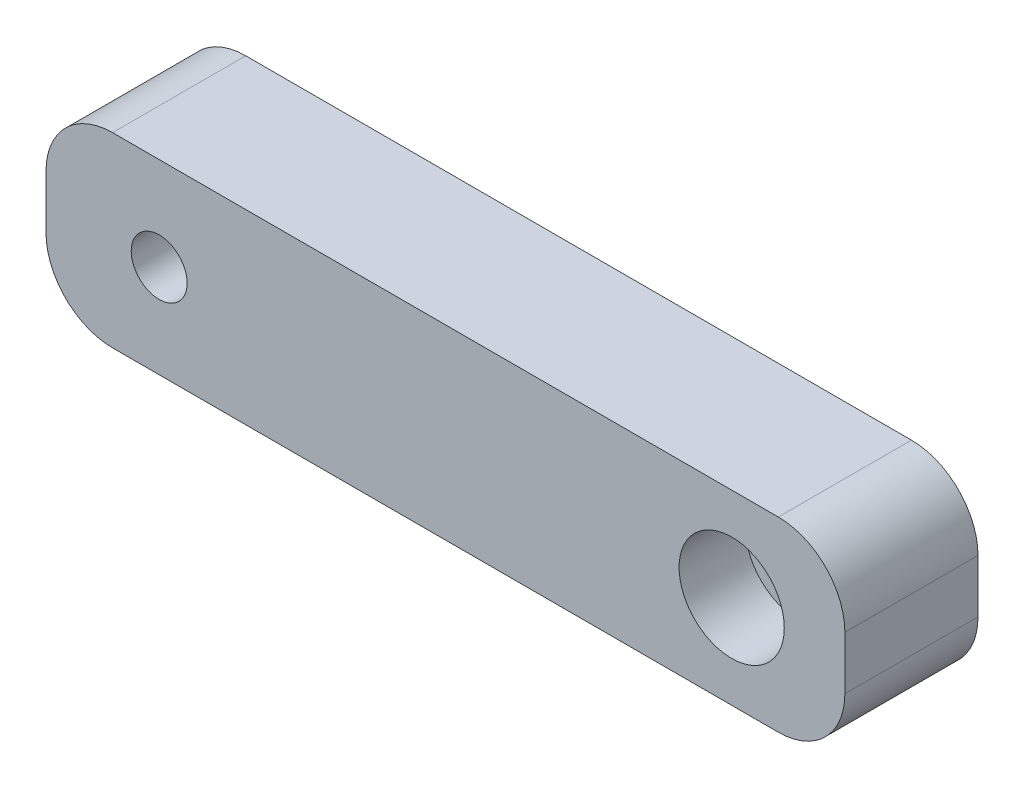
ISO-10303-21;
HEADER;
FILE_DESCRIPTION(('STEP AP214'),'2;1');
FILE_NAME('part.step','',(''),(''),'','','');
FILE_SCHEMA(('AUTOMOTIVE_DESIGN { 1 0 10303 214 1 1 1 1 }'));
ENDSEC;
DATA;
#1=APPLICATION_CONTEXT('core data for automotive mechanical design processes');
#2=APPLICATION_PROTOCOL_DEFINITION('international standard','automotive_design',2000,#1);
#3=PRODUCT_CONTEXT('',#1,'mechanical');
#4=PRODUCT('Part','Part','',(#3));
#5=PRODUCT_RELATED_PRODUCT_CATEGORY('part','',(#4));
#6=PRODUCT_DEFINITION_FORMATION('','',#4);
#7=PRODUCT_DEFINITION_CONTEXT('part definition',#1,'design');
#8=PRODUCT_DEFINITION('design','',#6,#7);
#9=PRODUCT_DEFINITION_SHAPE('','',#8);
#10=(LENGTH_UNIT() NAMED_UNIT(*) SI_UNIT(.MILLI.,.METRE.));
#11=(NAMED_UNIT(*) PLANE_ANGLE_UNIT() SI_UNIT($,.RADIAN.));
#12=(NAMED_UNIT(*) SI_UNIT($,.STERADIAN.) SOLID_ANGLE_UNIT());
#13=UNCERTAINTY_MEASURE_WITH_UNIT(LENGTH_MEASURE(1.E-05),#10,'distance_accuracy_value','');
#14=(GEOMETRIC_REPRESENTATION_CONTEXT(3) GLOBAL_UNCERTAINTY_ASSIGNED_CONTEXT((#13)) GLOBAL_UNIT_ASSIGNED_CONTEXT((#10,
#11,#12)) REPRESENTATION_CONTEXT('',''));
#15=CARTESIAN_POINT('',(0.,0.,0.));
#16=DIRECTION('',(0.,0.,1.));
#17=DIRECTION('',(1.,0.,0.));
#18=AXIS2_PLACEMENT_3D('',#15,#16,#17);
#19=CARTESIAN_POINT('',(-7.85061824324326,13.3019459459459,-0.00100000000000013));
#20=DIRECTION('',(0.,0.,1.));
#21=DIRECTION('',(1.,0.,0.));
#22=AXIS2_PLACEMENT_3D('',#19,#20,#21);
#23=CYLINDRICAL_SURFACE('',#22,2.);
#24=CARTESIAN_POINT('',(-7.85061824324326,13.3019459459459,5.));
#25=DIRECTION('',(0.,0.,1.));
#26=DIRECTION('',(1.,0.,0.));
#27=AXIS2_PLACEMENT_3D('',#24,#25,#26);
#28=CIRCLE('',#27,2.);
#29=CARTESIAN_POINT('',(-5.85061824324326,13.3019459459459,5.));
#30=VERTEX_POINT('',#29);
#31=EDGE_CURVE('E389',#30,#30,#28,.T.);
#32=ORIENTED_EDGE('',*,*,#31,.T.);
#33=EDGE_LOOP('',(#32));
#34=FACE_BOUND('',#33,.T.);
#35=CARTESIAN_POINT('',(-7.85061824324326,13.3019459459459,0.5));
#36=DIRECTION('',(0.,0.,-1.));
#37=DIRECTION('',(-1.,0.,0.));
#38=AXIS2_PLACEMENT_3D('',#35,#36,#37);
#39=CIRCLE('',#38,2.);
#40=CARTESIAN_POINT('',(-9.85061824324326,13.3019459459459,0.5));
#41=VERTEX_POINT('',#40);
#42=EDGE_CURVE('E53',#41,#41,#39,.F.);
#43=ORIENTED_EDGE('',*,*,#42,.F.);
#44=EDGE_LOOP('',(#43));
#45=FACE_BOUND('',#44,.T.);
#46=ADVANCED_FACE('F49',(#34,#45),#23,.F.);
#47=CARTESIAN_POINT('',(-59.3506182432433,20.3019459459459,10.));
#48=DIRECTION('',(1.,0.,0.));
#49=DIRECTION('',(0.,0.,-1.));
#50=AXIS2_PLACEMENT_3D('',#47,#48,#49);
#51=PLANE('',#50);
#52=DIRECTION('',(0.,-1.,0.));
#53=VECTOR('',#52,1.);
#54=CARTESIAN_POINT('',(-59.3506182432433,20.3019459459459,0.));
#55=LINE('',#54,#53);
#56=CARTESIAN_POINT('',(-59.3506182432433,15.3019459459459,0.));
#57=VERTEX_POINT('',#56);
#58=CARTESIAN_POINT('',(-59.3506182432433,11.3019459459459,0.));
#59=VERTEX_POINT('',#58);
#60=EDGE_CURVE('E131',#57,#59,#55,.T.);
#61=ORIENTED_EDGE('',*,*,#60,.T.);
#62=DIRECTION('',(0.,0.,-1.));
#63=VECTOR('',#62,1.);
#64=CARTESIAN_POINT('',(-59.3506182432433,11.3019459459459,10.));
#65=LINE('',#64,#63);
#66=CARTESIAN_POINT('',(-59.3506182432433,11.3019459459459,10.));
#67=VERTEX_POINT('',#66);
#68=EDGE_CURVE('E11',#59,#67,#65,.F.);
#69=ORIENTED_EDGE('',*,*,#68,.T.);
#70=DIRECTION('',(0.,-1.,0.));
#71=VECTOR('',#70,1.);
#72=CARTESIAN_POINT('',(-59.3506182432433,20.3019459459459,10.));
#73=LINE('',#72,#71);
#74=CARTESIAN_POINT('',(-59.3506182432433,15.3019459459459,10.));
#75=VERTEX_POINT('',#74);
#76=EDGE_CURVE('E132',#75,#67,#73,.T.);
#77=ORIENTED_EDGE('',*,*,#76,.F.);
#78=DIRECTION('',(0.,0.,-1.));
#79=VECTOR('',#78,1.);
#80=CARTESIAN_POINT('',(-59.3506182432433,15.3019459459459,0.));
#81=LINE('',#80,#79);
#82=EDGE_CURVE('E122',#75,#57,#81,.T.);
#83=ORIENTED_EDGE('',*,*,#82,.T.);
#84=EDGE_LOOP('',(#61,#69,#77,#83));
#85=FACE_BOUND('',#84,.T.);
#86=ADVANCED_FACE('F130',(#85),#51,.F.);
#87=CARTESIAN_POINT('',(-59.3506182432433,6.30194594594594,10.));
#88=DIRECTION('',(0.,1.,0.));
#89=DIRECTION('',(0.,0.,1.));
#90=AXIS2_PLACEMENT_3D('',#87,#88,#89);
#91=PLANE('',#90);
#92=DIRECTION('',(1.,0.,0.));
#93=VECTOR('',#92,1.);
#94=CARTESIAN_POINT('',(-59.3506182432433,6.30194594594594,0.));
#95=LINE('',#94,#93);
#96=CARTESIAN_POINT('',(-54.3506182432433,6.30194594594594,0.));
#97=VERTEX_POINT('',#96);
#98=CARTESIAN_POINT('',(-4.35061824324326,6.30194594594594,0.));
#99=VERTEX_POINT('',#98);
#100=EDGE_CURVE('E141',#97,#99,#95,.T.);
#101=ORIENTED_EDGE('',*,*,#100,.T.);
#102=DIRECTION('',(0.,0.,-1.));
#103=VECTOR('',#102,1.);
#104=CARTESIAN_POINT('',(-4.35061824324326,6.30194594594594,10.));
#105=LINE('',#104,#103);
#106=CARTESIAN_POINT('',(-4.35061824324326,6.30194594594594,10.));
#107=VERTEX_POINT('',#106);
#108=EDGE_CURVE('E184',#99,#107,#105,.F.);
#109=ORIENTED_EDGE('',*,*,#108,.T.);
#110=DIRECTION('',(1.,0.,0.));
#111=VECTOR('',#110,1.);
#112=CARTESIAN_POINT('',(-59.3506182432433,6.30194594594594,10.));
#113=LINE('',#112,#111);
#114=CARTESIAN_POINT('',(-54.3506182432433,6.30194594594594,10.));
#115=VERTEX_POINT('',#114);
#116=EDGE_CURVE('E409',#115,#107,#113,.T.);
#117=ORIENTED_EDGE('',*,*,#116,.F.);
#118=DIRECTION('',(0.,0.,-1.));
#119=VECTOR('',#118,1.);
#120=CARTESIAN_POINT('',(-54.3506182432433,6.30194594594594,10.));
#121=LINE('',#120,#119);
#122=EDGE_CURVE('E180',#115,#97,#121,.T.);
#123=ORIENTED_EDGE('',*,*,#122,.T.);
#124=EDGE_LOOP('',(#101,#109,#117,#123));
#125=FACE_BOUND('',#124,.T.);
#126=ADVANCED_FACE('F226',(#125),#91,.F.);
#127=CARTESIAN_POINT('',(0.649381756756743,20.3019459459459,10.));
#128=DIRECTION('',(1.,0.,0.));
#129=DIRECTION('',(0.,1.,0.));
#130=AXIS2_PLACEMENT_3D('',#127,#128,#129);
#131=PLANE('',#130);
#132=DIRECTION('',(0.,-1.,0.));
#133=VECTOR('',#132,1.);
#134=CARTESIAN_POINT('',(0.649381756756743,20.3019459459459,10.));
#135=LINE('',#134,#133);
#136=CARTESIAN_POINT('',(0.649381756756744,15.3019459459459,10.));
#137=VERTEX_POINT('',#136);
#138=CARTESIAN_POINT('',(0.649381756756744,11.3019459459459,10.));
#139=VERTEX_POINT('',#138);
#140=EDGE_CURVE('E412',#137,#139,#135,.T.);
#141=ORIENTED_EDGE('',*,*,#140,.T.);
#142=DIRECTION('',(0.,0.,-1.));
#143=VECTOR('',#142,1.);
#144=CARTESIAN_POINT('',(0.649381756756744,11.3019459459459,0.));
#145=LINE('',#144,#143);
#146=CARTESIAN_POINT('',(0.649381756756744,11.3019459459459,0.));
#147=VERTEX_POINT('',#146);
#148=EDGE_CURVE('E168',#139,#147,#145,.T.);
#149=ORIENTED_EDGE('',*,*,#148,.T.);
#150=DIRECTION('',(0.,-1.,0.));
#151=VECTOR('',#150,1.);
#152=CARTESIAN_POINT('',(0.649381756756743,20.3019459459459,0.));
#153=LINE('',#152,#151);
#154=CARTESIAN_POINT('',(0.649381756756744,15.3019459459459,0.));
#155=VERTEX_POINT('',#154);
#156=EDGE_CURVE('E147',#155,#147,#153,.T.);
#157=ORIENTED_EDGE('',*,*,#156,.F.);
#158=DIRECTION('',(0.,0.,-1.));
#159=VECTOR('',#158,1.);
#160=CARTESIAN_POINT('',(0.649381756756744,15.3019459459459,10.));
#161=LINE('',#160,#159);
#162=EDGE_CURVE('E165',#155,#137,#161,.F.);
#163=ORIENTED_EDGE('',*,*,#162,.T.);
#164=EDGE_LOOP('',(#141,#149,#157,#163));
#165=FACE_BOUND('',#164,.T.);
#166=ADVANCED_FACE('F205',(#165),#131,.T.);
#167=CARTESIAN_POINT('',(-59.3506182432433,20.3019459459459,10.));
#168=DIRECTION('',(0.,1.,0.));
#169=DIRECTION('',(0.,0.,1.));
#170=AXIS2_PLACEMENT_3D('',#167,#168,#169);
#171=PLANE('',#170);
#172=DIRECTION('',(1.,0.,0.));
#173=VECTOR('',#172,1.);
#174=CARTESIAN_POINT('',(-59.3506182432433,20.3019459459459,10.));
#175=LINE('',#174,#173);
#176=CARTESIAN_POINT('',(-54.3506182432433,20.3019459459459,10.));
#177=VERTEX_POINT('',#176);
#178=CARTESIAN_POINT('',(-4.35061824324326,20.3019459459459,10.));
#179=VERTEX_POINT('',#178);
#180=EDGE_CURVE('E134',#177,#179,#175,.T.);
#181=ORIENTED_EDGE('',*,*,#180,.T.);
#182=DIRECTION('',(0.,0.,-1.));
#183=VECTOR('',#182,1.);
#184=CARTESIAN_POINT('',(-4.35061824324326,20.3019459459459,10.));
#185=LINE('',#184,#183);
#186=CARTESIAN_POINT('',(-4.35061824324326,20.3019459459459,0.));
#187=VERTEX_POINT('',#186);
#188=EDGE_CURVE('E59',#179,#187,#185,.T.);
#189=ORIENTED_EDGE('',*,*,#188,.T.);
#190=DIRECTION('',(1.,0.,0.));
#191=VECTOR('',#190,1.);
#192=CARTESIAN_POINT('',(-59.3506182432433,20.3019459459459,0.));
#193=LINE('',#192,#191);
#194=CARTESIAN_POINT('',(-54.3506182432433,20.3019459459459,0.));
#195=VERTEX_POINT('',#194);
#196=EDGE_CURVE('E157',#195,#187,#193,.T.);
#197=ORIENTED_EDGE('',*,*,#196,.F.);
#198=DIRECTION('',(0.,0.,-1.));
#199=VECTOR('',#198,1.);
#200=CARTESIAN_POINT('',(-54.3506182432433,20.3019459459459,10.));
#201=LINE('',#200,#199);
#202=EDGE_CURVE('E123',#195,#177,#201,.F.);
#203=ORIENTED_EDGE('',*,*,#202,.T.);
#204=EDGE_LOOP('',(#181,#189,#197,#203));
#205=FACE_BOUND('',#204,.T.);
#206=ADVANCED_FACE('F199',(#205),#171,.T.);
#207=CARTESIAN_POINT('',(0.,0.,10.));
#208=DIRECTION('',(0.,0.,1.));
#209=DIRECTION('',(1.,0.,0.));
#210=AXIS2_PLACEMENT_3D('',#207,#208,#209);
#211=PLANE('',#210);
#212=CARTESIAN_POINT('',(-50.8506182432433,13.3019459459459,10.));
#213=DIRECTION('',(0.,0.,-1.));
#214=DIRECTION('',(-1.,0.,0.));
#215=AXIS2_PLACEMENT_3D('',#212,#213,#214);
#216=CIRCLE('',#215,2.1);
#217=CARTESIAN_POINT('',(-52.9506182432432,13.3019459459459,10.));
#218=VERTEX_POINT('',#217);
#219=EDGE_CURVE('E385',#218,#218,#216,.T.);
#220=ORIENTED_EDGE('',*,*,#219,.T.);
#221=EDGE_LOOP('',(#220));
#222=FACE_BOUND('',#221,.T.);
#223=CARTESIAN_POINT('',(-7.85061824324326,13.3019459459459,10.));
#224=DIRECTION('',(0.,0.,1.));
#225=DIRECTION('',(1.,0.,0.));
#226=AXIS2_PLACEMENT_3D('',#223,#224,#225);
#227=CIRCLE('',#226,3.95);
#228=CARTESIAN_POINT('',(-3.90061824324326,13.3019459459459,10.));
#229=VERTEX_POINT('',#228);
#230=EDGE_CURVE('E392',#229,#229,#227,.T.);
#231=ORIENTED_EDGE('',*,*,#230,.F.);
#232=EDGE_LOOP('',(#231));
#233=FACE_BOUND('',#232,.T.);
#234=ORIENTED_EDGE('',*,*,#116,.T.);
#235=CARTESIAN_POINT('',(-4.35061824324326,11.3019459459459,10.));
#236=DIRECTION('',(0.,0.,1.));
#237=DIRECTION('',(1.,0.,0.));
#238=AXIS2_PLACEMENT_3D('',#235,#236,#237);
#239=CIRCLE('',#238,5.);
#240=EDGE_CURVE('E192',#107,#139,#239,.T.);
#241=ORIENTED_EDGE('',*,*,#240,.T.);
#242=ORIENTED_EDGE('',*,*,#140,.F.);
#243=CARTESIAN_POINT('',(-4.35061824324326,15.3019459459459,10.));
#244=DIRECTION('',(0.,0.,1.));
#245=DIRECTION('',(1.,0.,0.));
#246=AXIS2_PLACEMENT_3D('',#243,#244,#245);
#247=CIRCLE('',#246,5.);
#248=EDGE_CURVE('E72',#137,#179,#247,.T.);
#249=ORIENTED_EDGE('',*,*,#248,.T.);
#250=ORIENTED_EDGE('',*,*,#180,.F.);
#251=CARTESIAN_POINT('',(-54.3506182432433,15.3019459459459,10.));
#252=DIRECTION('',(0.,0.,1.));
#253=DIRECTION('',(1.,0.,0.));
#254=AXIS2_PLACEMENT_3D('',#251,#252,#253);
#255=CIRCLE('',#254,5.);
#256=EDGE_CURVE('E162',#177,#75,#255,.T.);
#257=ORIENTED_EDGE('',*,*,#256,.T.);
#258=ORIENTED_EDGE('',*,*,#76,.T.);
#259=CARTESIAN_POINT('',(-54.3506182432433,11.3019459459459,10.));
#260=DIRECTION('',(0.,0.,1.));
#261=DIRECTION('',(1.,0.,0.));
#262=AXIS2_PLACEMENT_3D('',#259,#260,#261);
#263=CIRCLE('',#262,5.);
#264=EDGE_CURVE('E187',#67,#115,#263,.T.);
#265=ORIENTED_EDGE('',*,*,#264,.T.);
#266=EDGE_LOOP('',(#234,#241,#242,#249,#250,#257,#258,#265));
#267=FACE_BOUND('',#266,.T.);
#268=ADVANCED_FACE('F253',(#222,#233,#267),#211,.T.);
#269=CARTESIAN_POINT('',(0.,0.,0.));
#270=DIRECTION('',(0.,0.,1.));
#271=DIRECTION('',(1.,0.,0.));
#272=AXIS2_PLACEMENT_3D('',#269,#270,#271);
#273=PLANE('',#272);
#274=CARTESIAN_POINT('',(-7.85061824324326,13.3019459459459,0.));
#275=DIRECTION('',(0.,0.,-1.));
#276=DIRECTION('',(-1.,0.,0.));
#277=AXIS2_PLACEMENT_3D('',#274,#275,#276);
#278=CIRCLE('',#277,4.1);
#279=CARTESIAN_POINT('',(-11.9506182432433,13.3019459459459,0.));
#280=VERTEX_POINT('',#279);
#281=EDGE_CURVE('E379',#280,#280,#278,.T.);
#282=ORIENTED_EDGE('',*,*,#281,.F.);
#283=EDGE_LOOP('',(#282));
#284=FACE_BOUND('',#283,.T.);
#285=CARTESIAN_POINT('',(-50.8506182432433,13.3019459459459,0.));
#286=DIRECTION('',(0.,0.,-1.));
#287=DIRECTION('',(-1.,0.,0.));
#288=AXIS2_PLACEMENT_3D('',#285,#286,#287);
#289=CIRCLE('',#288,4.);
#290=CARTESIAN_POINT('',(-54.8506182432432,13.3019459459459,0.));
#291=VERTEX_POINT('',#290);
#292=EDGE_CURVE('E150',#291,#291,#289,.T.);
#293=ORIENTED_EDGE('',*,*,#292,.F.);
#294=EDGE_LOOP('',(#293));
#295=FACE_BOUND('',#294,.T.);
#296=ORIENTED_EDGE('',*,*,#156,.T.);
#297=CARTESIAN_POINT('',(-4.35061824324326,11.3019459459459,0.));
#298=DIRECTION('',(0.,0.,1.));
#299=DIRECTION('',(1.,0.,0.));
#300=AXIS2_PLACEMENT_3D('',#297,#298,#299);
#301=CIRCLE('',#300,5.);
#302=EDGE_CURVE('E177',#147,#99,#301,.F.);
#303=ORIENTED_EDGE('',*,*,#302,.T.);
#304=ORIENTED_EDGE('',*,*,#100,.F.);
#305=CARTESIAN_POINT('',(-54.3506182432433,11.3019459459459,0.));
#306=DIRECTION('',(0.,0.,1.));
#307=DIRECTION('',(1.,0.,0.));
#308=AXIS2_PLACEMENT_3D('',#305,#306,#307);
#309=CIRCLE('',#308,5.);
#310=EDGE_CURVE('E139',#97,#59,#309,.F.);
#311=ORIENTED_EDGE('',*,*,#310,.T.);
#312=ORIENTED_EDGE('',*,*,#60,.F.);
#313=CARTESIAN_POINT('',(-54.3506182432433,15.3019459459459,0.));
#314=DIRECTION('',(0.,0.,1.));
#315=DIRECTION('',(1.,0.,0.));
#316=AXIS2_PLACEMENT_3D('',#313,#314,#315);
#317=CIRCLE('',#316,5.);
#318=EDGE_CURVE('E118',#57,#195,#317,.F.);
#319=ORIENTED_EDGE('',*,*,#318,.T.);
#320=ORIENTED_EDGE('',*,*,#196,.T.);
#321=CARTESIAN_POINT('',(-4.35061824324326,15.3019459459459,0.));
#322=DIRECTION('',(0.,0.,1.));
#323=DIRECTION('',(1.,0.,0.));
#324=AXIS2_PLACEMENT_3D('',#321,#322,#323);
#325=CIRCLE('',#324,5.);
#326=EDGE_CURVE('E174',#187,#155,#325,.F.);
#327=ORIENTED_EDGE('',*,*,#326,.T.);
#328=EDGE_LOOP('',(#296,#303,#304,#311,#312,#319,#320,#327));
#329=FACE_BOUND('',#328,.T.);
#330=ADVANCED_FACE('F137',(#284,#295,#329),#273,.F.);
#331=CARTESIAN_POINT('',(-54.3506182432433,15.3019459459459,10.));
#332=DIRECTION('',(0.,0.,1.));
#333=DIRECTION('',(1.,0.,0.));
#334=AXIS2_PLACEMENT_3D('',#331,#332,#333);
#335=CYLINDRICAL_SURFACE('',#334,5.);
#336=ORIENTED_EDGE('',*,*,#256,.F.);
#337=ORIENTED_EDGE('',*,*,#202,.F.);
#338=ORIENTED_EDGE('',*,*,#318,.F.);
#339=ORIENTED_EDGE('',*,*,#82,.F.);
#340=EDGE_LOOP('',(#336,#337,#338,#339));
#341=FACE_BOUND('',#340,.T.);
#342=ADVANCED_FACE('F121',(#341),#335,.T.);
#343=CARTESIAN_POINT('',(-4.35061824324326,11.3019459459459,10.));
#344=DIRECTION('',(0.,0.,1.));
#345=DIRECTION('',(1.,0.,0.));
#346=AXIS2_PLACEMENT_3D('',#343,#344,#345);
#347=CYLINDRICAL_SURFACE('',#346,5.);
#348=ORIENTED_EDGE('',*,*,#240,.F.);
#349=ORIENTED_EDGE('',*,*,#108,.F.);
#350=ORIENTED_EDGE('',*,*,#302,.F.);
#351=ORIENTED_EDGE('',*,*,#148,.F.);
#352=EDGE_LOOP('',(#348,#349,#350,#351));
#353=FACE_BOUND('',#352,.T.);
#354=ADVANCED_FACE('F209',(#353),#347,.T.);
#355=CARTESIAN_POINT('',(-4.35061824324326,15.3019459459459,10.));
#356=DIRECTION('',(0.,0.,-1.));
#357=DIRECTION('',(-1.,0.,0.));
#358=AXIS2_PLACEMENT_3D('',#355,#356,#357);
#359=CYLINDRICAL_SURFACE('',#358,5.);
#360=ORIENTED_EDGE('',*,*,#248,.F.);
#361=ORIENTED_EDGE('',*,*,#162,.F.);
#362=ORIENTED_EDGE('',*,*,#326,.F.);
#363=ORIENTED_EDGE('',*,*,#188,.F.);
#364=EDGE_LOOP('',(#360,#361,#362,#363));
#365=FACE_BOUND('',#364,.T.);
#366=ADVANCED_FACE('F207',(#365),#359,.T.);
#367=CARTESIAN_POINT('',(-54.3506182432433,11.3019459459459,10.));
#368=DIRECTION('',(0.,0.,-1.));
#369=DIRECTION('',(-1.,0.,0.));
#370=AXIS2_PLACEMENT_3D('',#367,#368,#369);
#371=CYLINDRICAL_SURFACE('',#370,5.);
#372=ORIENTED_EDGE('',*,*,#264,.F.);
#373=ORIENTED_EDGE('',*,*,#68,.F.);
#374=ORIENTED_EDGE('',*,*,#310,.F.);
#375=ORIENTED_EDGE('',*,*,#122,.F.);
#376=EDGE_LOOP('',(#372,#373,#374,#375));
#377=FACE_BOUND('',#376,.T.);
#378=ADVANCED_FACE('F51',(#377),#371,.T.);
#379=CARTESIAN_POINT('',(-50.8506182432433,13.3019459459459,2.5));
#380=DIRECTION('',(0.,0.,-1.));
#381=DIRECTION('',(-1.,0.,0.));
#382=AXIS2_PLACEMENT_3D('',#379,#380,#381);
#383=CYLINDRICAL_SURFACE('',#382,4.);
#384=CARTESIAN_POINT('',(-50.8506182432433,13.3019459459459,2.5));
#385=DIRECTION('',(0.,0.,-1.));
#386=DIRECTION('',(-1.,0.,0.));
#387=AXIS2_PLACEMENT_3D('',#384,#385,#386);
#388=CIRCLE('',#387,4.);
#389=CARTESIAN_POINT('',(-54.8506182432432,13.3019459459459,2.5));
#390=VERTEX_POINT('',#389);
#391=EDGE_CURVE('E142',#390,#390,#388,.T.);
#392=ORIENTED_EDGE('',*,*,#391,.F.);
#393=EDGE_LOOP('',(#392));
#394=FACE_BOUND('',#393,.T.);
#395=ORIENTED_EDGE('',*,*,#292,.T.);
#396=EDGE_LOOP('',(#395));
#397=FACE_BOUND('',#396,.T.);
#398=ADVANCED_FACE('F214',(#394,#397),#383,.F.);
#399=CARTESIAN_POINT('',(-50.8506182432433,13.3019459459459,2.5));
#400=DIRECTION('',(0.,0.,-1.));
#401=DIRECTION('',(-1.,0.,0.));
#402=AXIS2_PLACEMENT_3D('',#399,#400,#401);
#403=PLANE('',#402);
#404=CARTESIAN_POINT('',(-50.8506182432433,13.3019459459459,2.5));
#405=DIRECTION('',(0.,0.,-1.));
#406=DIRECTION('',(-1.,0.,0.));
#407=AXIS2_PLACEMENT_3D('',#404,#405,#406);
#408=CIRCLE('',#407,2.1);
#409=CARTESIAN_POINT('',(-52.9506182432432,13.3019459459459,2.5));
#410=VERTEX_POINT('',#409);
#411=EDGE_CURVE('E397',#410,#410,#408,.T.);
#412=ORIENTED_EDGE('',*,*,#411,.F.);
#413=EDGE_LOOP('',(#412));
#414=FACE_BOUND('',#413,.T.);
#415=ORIENTED_EDGE('',*,*,#391,.T.);
#416=EDGE_LOOP('',(#415));
#417=FACE_BOUND('',#416,.T.);
#418=ADVANCED_FACE('F245',(#414,#417),#403,.T.);
#419=CARTESIAN_POINT('',(-50.8506182432433,13.3019459459459,4.5));
#420=DIRECTION('',(0.,0.,-1.));
#421=DIRECTION('',(-1.,0.,0.));
#422=AXIS2_PLACEMENT_3D('',#419,#420,#421);
#423=CYLINDRICAL_SURFACE('',#422,2.1);
#424=ORIENTED_EDGE('',*,*,#411,.T.);
#425=EDGE_LOOP('',(#424));
#426=FACE_BOUND('',#425,.T.);
#427=ORIENTED_EDGE('',*,*,#219,.F.);
#428=EDGE_LOOP('',(#427));
#429=FACE_BOUND('',#428,.T.);
#430=ADVANCED_FACE('F242',(#426,#429),#423,.F.);
#431=CARTESIAN_POINT('',(-7.85061824324326,13.3019459459459,5.));
#432=DIRECTION('',(0.,0.,1.));
#433=DIRECTION('',(1.,0.,0.));
#434=AXIS2_PLACEMENT_3D('',#431,#432,#433);
#435=CYLINDRICAL_SURFACE('',#434,3.95);
#436=CARTESIAN_POINT('',(-7.85061824324326,13.3019459459459,5.));
#437=DIRECTION('',(0.,0.,1.));
#438=DIRECTION('',(1.,0.,0.));
#439=AXIS2_PLACEMENT_3D('',#436,#437,#438);
#440=CIRCLE('',#439,3.95);
#441=CARTESIAN_POINT('',(-3.90061824324326,13.3019459459459,5.));
#442=VERTEX_POINT('',#441);
#443=EDGE_CURVE('E393',#442,#442,#440,.T.);
#444=ORIENTED_EDGE('',*,*,#443,.F.);
#445=EDGE_LOOP('',(#444));
#446=FACE_BOUND('',#445,.T.);
#447=ORIENTED_EDGE('',*,*,#230,.T.);
#448=EDGE_LOOP('',(#447));
#449=FACE_BOUND('',#448,.T.);
#450=ADVANCED_FACE('F238',(#446,#449),#435,.F.);
#451=CARTESIAN_POINT('',(-7.85061824324326,13.3019459459459,5.));
#452=DIRECTION('',(0.,0.,1.));
#453=DIRECTION('',(1.,0.,0.));
#454=AXIS2_PLACEMENT_3D('',#451,#452,#453);
#455=PLANE('',#454);
#456=ORIENTED_EDGE('',*,*,#31,.F.);
#457=EDGE_LOOP('',(#456));
#458=FACE_BOUND('',#457,.T.);
#459=ORIENTED_EDGE('',*,*,#443,.T.);
#460=EDGE_LOOP('',(#459));
#461=FACE_BOUND('',#460,.T.);
#462=ADVANCED_FACE('F234',(#458,#461),#455,.T.);
#463=CARTESIAN_POINT('',(-7.85061824324326,13.3019459459459,0.5));
#464=DIRECTION('',(0.,0.,-1.));
#465=DIRECTION('',(-1.,0.,0.));
#466=AXIS2_PLACEMENT_3D('',#463,#464,#465);
#467=PLANE('',#466);
#468=CARTESIAN_POINT('',(-7.85061824324326,13.3019459459459,0.5));
#469=DIRECTION('',(0.,0.,-1.));
#470=DIRECTION('',(-1.,0.,0.));
#471=AXIS2_PLACEMENT_3D('',#468,#469,#470);
#472=CIRCLE('',#471,4.1);
#473=CARTESIAN_POINT('',(-11.9506182432433,13.3019459459459,0.5));
#474=VERTEX_POINT('',#473);
#475=EDGE_CURVE('E376',#474,#474,#472,.T.);
#476=ORIENTED_EDGE('',*,*,#475,.T.);
#477=EDGE_LOOP('',(#476));
#478=FACE_BOUND('',#477,.T.);
#479=ORIENTED_EDGE('',*,*,#42,.T.);
#480=EDGE_LOOP('',(#479));
#481=FACE_BOUND('',#480,.T.);
#482=ADVANCED_FACE('F237',(#478,#481),#467,.T.);
#483=CARTESIAN_POINT('',(-7.85061824324326,13.3019459459459,0.5));
#484=DIRECTION('',(0.,0.,-1.));
#485=DIRECTION('',(-1.,0.,0.));
#486=AXIS2_PLACEMENT_3D('',#483,#484,#485);
#487=CYLINDRICAL_SURFACE('',#486,4.1);
#488=ORIENTED_EDGE('',*,*,#475,.F.);
#489=EDGE_LOOP('',(#488));
#490=FACE_BOUND('',#489,.T.);
#491=ORIENTED_EDGE('',*,*,#281,.T.);
#492=EDGE_LOOP('',(#491));
#493=FACE_BOUND('',#492,.T.);
#494=ADVANCED_FACE('F232',(#490,#493),#487,.F.);
#495=CLOSED_SHELL('',(#46,#86,#126,#166,#206,#268,#330,#342,#354,#366,#378,#398,#418,#430,#450,
#462,#482,#494));
#496=MANIFOLD_SOLID_BREP('B2',#495);
#497=ADVANCED_BREP_SHAPE_REPRESENTATION('',(#18,#496),#14);
#498=SHAPE_DEFINITION_REPRESENTATION(#9,#497);
ENDSEC;
END-ISO-10303-21;
